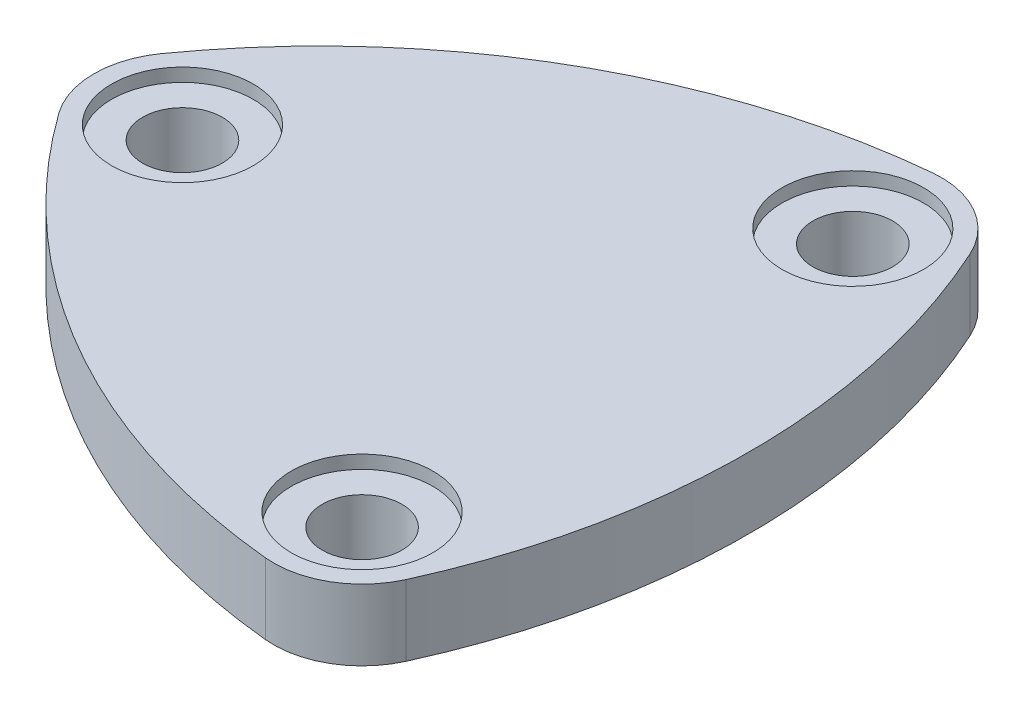
ISO-10303-21;
HEADER;
FILE_DESCRIPTION(('STEP AP214'),'2;1');
FILE_NAME('part.step','',(''),(''),'','','');
FILE_SCHEMA(('AUTOMOTIVE_DESIGN { 1 0 10303 214 1 1 1 1 }'));
ENDSEC;
DATA;
#1=APPLICATION_CONTEXT('core data for automotive mechanical design processes');
#2=APPLICATION_PROTOCOL_DEFINITION('international standard','automotive_design',2000,#1);
#3=PRODUCT_CONTEXT('',#1,'mechanical');
#4=PRODUCT('Part','Part','',(#3));
#5=PRODUCT_RELATED_PRODUCT_CATEGORY('part','',(#4));
#6=PRODUCT_DEFINITION_FORMATION('','',#4);
#7=PRODUCT_DEFINITION_CONTEXT('part definition',#1,'design');
#8=PRODUCT_DEFINITION('design','',#6,#7);
#9=PRODUCT_DEFINITION_SHAPE('','',#8);
#10=(LENGTH_UNIT() NAMED_UNIT(*) SI_UNIT(.MILLI.,.METRE.));
#11=(NAMED_UNIT(*) PLANE_ANGLE_UNIT() SI_UNIT($,.RADIAN.));
#12=(NAMED_UNIT(*) SI_UNIT($,.STERADIAN.) SOLID_ANGLE_UNIT());
#13=UNCERTAINTY_MEASURE_WITH_UNIT(LENGTH_MEASURE(1.E-05),#10,'distance_accuracy_value','');
#14=(GEOMETRIC_REPRESENTATION_CONTEXT(3) GLOBAL_UNCERTAINTY_ASSIGNED_CONTEXT((#13)) GLOBAL_UNIT_ASSIGNED_CONTEXT((#10,
#11,#12)) REPRESENTATION_CONTEXT('',''));
#15=CARTESIAN_POINT('',(0.,0.,0.));
#16=DIRECTION('',(0.,0.,1.));
#17=DIRECTION('',(1.,0.,0.));
#18=AXIS2_PLACEMENT_3D('',#15,#16,#17);
#19=CARTESIAN_POINT('',(16.0000000000001,8.,27.7128129211029));
#20=DIRECTION('',(0.,-1.,0.));
#21=DIRECTION('',(0.,0.,-1.));
#22=AXIS2_PLACEMENT_3D('',#19,#20,#21);
#23=CYLINDRICAL_SURFACE('',#22,4.5);
#24=CARTESIAN_POINT('',(16.0000000000001,0.,27.7128129211029));
#25=DIRECTION('',(0.,1.,0.));
#26=DIRECTION('',(0.,0.,1.));
#27=AXIS2_PLACEMENT_3D('',#24,#25,#26);
#28=CIRCLE('',#27,4.5);
#29=CARTESIAN_POINT('',(16.0000000000001,0.,32.2128129211029));
#30=VERTEX_POINT('',#29);
#31=EDGE_CURVE('E160',#30,#30,#28,.T.);
#32=ORIENTED_EDGE('',*,*,#31,.F.);
#33=EDGE_LOOP('',(#32));
#34=FACE_BOUND('',#33,.T.);
#35=CARTESIAN_POINT('',(16.0000000000001,6.5,27.7128129211029));
#36=DIRECTION('',(0.,1.,0.));
#37=DIRECTION('',(0.,0.,1.));
#38=AXIS2_PLACEMENT_3D('',#35,#36,#37);
#39=CIRCLE('',#38,4.5);
#40=CARTESIAN_POINT('',(16.0000000000001,6.5,32.2128129211029));
#41=VERTEX_POINT('',#40);
#42=EDGE_CURVE('E35',#41,#41,#39,.T.);
#43=ORIENTED_EDGE('',*,*,#42,.T.);
#44=EDGE_LOOP('',(#43));
#45=FACE_BOUND('',#44,.T.);
#46=ADVANCED_FACE('F31',(#34,#45),#23,.F.);
#47=CARTESIAN_POINT('',(16.0000000000001,8.,-27.712812921102));
#48=DIRECTION('',(0.,-1.,0.));
#49=DIRECTION('',(0.,0.,-1.));
#50=AXIS2_PLACEMENT_3D('',#47,#48,#49);
#51=CYLINDRICAL_SURFACE('',#50,4.5);
#52=CARTESIAN_POINT('',(16.0000000000001,0.,-27.712812921102));
#53=DIRECTION('',(0.,1.,0.));
#54=DIRECTION('',(0.,0.,1.));
#55=AXIS2_PLACEMENT_3D('',#52,#53,#54);
#56=CIRCLE('',#55,4.5);
#57=CARTESIAN_POINT('',(16.0000000000001,0.,-23.212812921102));
#58=VERTEX_POINT('',#57);
#59=EDGE_CURVE('E96',#58,#58,#56,.T.);
#60=ORIENTED_EDGE('',*,*,#59,.F.);
#61=EDGE_LOOP('',(#60));
#62=FACE_BOUND('',#61,.T.);
#63=CARTESIAN_POINT('',(16.0000000000001,6.5,-27.712812921102));
#64=DIRECTION('',(0.,1.,0.));
#65=DIRECTION('',(0.,0.,1.));
#66=AXIS2_PLACEMENT_3D('',#63,#64,#65);
#67=CIRCLE('',#66,4.5);
#68=CARTESIAN_POINT('',(16.0000000000001,6.5,-23.212812921102));
#69=VERTEX_POINT('',#68);
#70=EDGE_CURVE('E135',#69,#69,#67,.T.);
#71=ORIENTED_EDGE('',*,*,#70,.T.);
#72=EDGE_LOOP('',(#71));
#73=FACE_BOUND('',#72,.T.);
#74=ADVANCED_FACE('F190',(#62,#73),#51,.F.);
#75=CARTESIAN_POINT('',(-32.,8.,0.));
#76=DIRECTION('',(0.,-1.,0.));
#77=DIRECTION('',(0.,0.,-1.));
#78=AXIS2_PLACEMENT_3D('',#75,#76,#77);
#79=CYLINDRICAL_SURFACE('',#78,4.5);
#80=CARTESIAN_POINT('',(-32.,0.,0.));
#81=DIRECTION('',(0.,1.,0.));
#82=DIRECTION('',(0.,0.,1.));
#83=AXIS2_PLACEMENT_3D('',#80,#81,#82);
#84=CIRCLE('',#83,4.5);
#85=CARTESIAN_POINT('',(-32.,0.,4.5));
#86=VERTEX_POINT('',#85);
#87=EDGE_CURVE('E133',#86,#86,#84,.T.);
#88=ORIENTED_EDGE('',*,*,#87,.F.);
#89=EDGE_LOOP('',(#88));
#90=FACE_BOUND('',#89,.T.);
#91=CARTESIAN_POINT('',(-32.,6.5,0.));
#92=DIRECTION('',(0.,1.,0.));
#93=DIRECTION('',(0.,0.,1.));
#94=AXIS2_PLACEMENT_3D('',#91,#92,#93);
#95=CIRCLE('',#94,4.5);
#96=CARTESIAN_POINT('',(-32.,6.5,4.5));
#97=VERTEX_POINT('',#96);
#98=EDGE_CURVE('E131',#97,#97,#95,.T.);
#99=ORIENTED_EDGE('',*,*,#98,.T.);
#100=EDGE_LOOP('',(#99));
#101=FACE_BOUND('',#100,.T.);
#102=ADVANCED_FACE('F196',(#90,#101),#79,.F.);
#103=CARTESIAN_POINT('',(-45.0000000000009,8.,-3.05311331771918E-13));
#104=DIRECTION('',(0.,-1.,0.));
#105=DIRECTION('',(0.,0.,-1.));
#106=AXIS2_PLACEMENT_3D('',#103,#104,#105);
#107=CYLINDRICAL_SURFACE('',#106,77.0000000000008);
#108=CARTESIAN_POINT('',(-45.0000000000009,0.,-3.05311331771918E-13));
#109=DIRECTION('',(0.,1.,0.));
#110=DIRECTION('',(0.,0.,1.));
#111=AXIS2_PLACEMENT_3D('',#108,#109,#110);
#112=CIRCLE('',#111,77.0000000000008);
#113=CARTESIAN_POINT('',(25.1044776119406,0.,31.8490536555953));
#114=VERTEX_POINT('',#113);
#115=CARTESIAN_POINT('',(25.1044776119405,0.,-31.8490536555947));
#116=VERTEX_POINT('',#115);
#117=EDGE_CURVE('E119',#114,#116,#112,.T.);
#118=ORIENTED_EDGE('',*,*,#117,.T.);
#119=DIRECTION('',(0.,-1.,0.));
#120=VECTOR('',#119,1.);
#121=CARTESIAN_POINT('',(25.1044776119405,8.,-31.8490536555947));
#122=LINE('',#121,#120);
#123=CARTESIAN_POINT('',(25.1044776119405,8.,-31.8490536555947));
#124=VERTEX_POINT('',#123);
#125=EDGE_CURVE('E40',#124,#116,#122,.T.);
#126=ORIENTED_EDGE('',*,*,#125,.F.);
#127=CARTESIAN_POINT('',(-45.0000000000009,8.,-3.05311331771918E-13));
#128=DIRECTION('',(0.,1.,0.));
#129=DIRECTION('',(0.,0.,1.));
#130=AXIS2_PLACEMENT_3D('',#127,#128,#129);
#131=CIRCLE('',#130,77.0000000000008);
#132=CARTESIAN_POINT('',(25.1044776119406,8.,31.8490536555953));
#133=VERTEX_POINT('',#132);
#134=EDGE_CURVE('E111',#133,#124,#131,.T.);
#135=ORIENTED_EDGE('',*,*,#134,.F.);
#136=DIRECTION('',(0.,-1.,0.));
#137=VECTOR('',#136,1.);
#138=CARTESIAN_POINT('',(25.10447761194,8.,31.849053655595));
#139=LINE('',#138,#137);
#140=EDGE_CURVE('E11',#133,#114,#139,.T.);
#141=ORIENTED_EDGE('',*,*,#140,.T.);
#142=EDGE_LOOP('',(#118,#126,#135,#141));
#143=FACE_BOUND('',#142,.T.);
#144=ADVANCED_FACE('F33',(#143),#107,.T.);
#145=CARTESIAN_POINT('',(22.5000000000004,8.,38.9711431703006));
#146=DIRECTION('',(0.,-1.,0.));
#147=DIRECTION('',(0.,0.,-1.));
#148=AXIS2_PLACEMENT_3D('',#145,#146,#147);
#149=CYLINDRICAL_SURFACE('',#148,77.0000000000008);
#150=CARTESIAN_POINT('',(22.5000000000004,0.,38.9711431703006));
#151=DIRECTION('',(0.,1.,0.));
#152=DIRECTION('',(0.,0.,1.));
#153=AXIS2_PLACEMENT_3D('',#150,#151,#152);
#154=CIRCLE('',#153,77.0000000000008);
#155=CARTESIAN_POINT('',(-40.1343283582089,0.,-5.81658853288062));
#156=VERTEX_POINT('',#155);
#157=CARTESIAN_POINT('',(15.0298507462688,0.,-37.6656421884754));
#158=VERTEX_POINT('',#157);
#159=EDGE_CURVE('E103',#156,#158,#154,.F.);
#160=ORIENTED_EDGE('',*,*,#159,.F.);
#161=DIRECTION('',(0.,-1.,0.));
#162=VECTOR('',#161,1.);
#163=CARTESIAN_POINT('',(-40.1343283582089,8.,-5.81658853288062));
#164=LINE('',#163,#162);
#165=CARTESIAN_POINT('',(-40.1343283582089,8.,-5.81658853288062));
#166=VERTEX_POINT('',#165);
#167=EDGE_CURVE('E88',#166,#156,#164,.T.);
#168=ORIENTED_EDGE('',*,*,#167,.F.);
#169=CARTESIAN_POINT('',(22.5000000000004,8.,38.9711431703006));
#170=DIRECTION('',(0.,1.,0.));
#171=DIRECTION('',(0.,0.,1.));
#172=AXIS2_PLACEMENT_3D('',#169,#170,#171);
#173=CIRCLE('',#172,77.0000000000008);
#174=CARTESIAN_POINT('',(15.0298507462688,8.,-37.6656421884754));
#175=VERTEX_POINT('',#174);
#176=EDGE_CURVE('E102',#166,#175,#173,.F.);
#177=ORIENTED_EDGE('',*,*,#176,.T.);
#178=DIRECTION('',(0.,-1.,0.));
#179=VECTOR('',#178,1.);
#180=CARTESIAN_POINT('',(15.0298507462688,8.,-37.6656421884754));
#181=LINE('',#180,#179);
#182=EDGE_CURVE('E104',#175,#158,#181,.T.);
#183=ORIENTED_EDGE('',*,*,#182,.T.);
#184=EDGE_LOOP('',(#160,#168,#177,#183));
#185=FACE_BOUND('',#184,.T.);
#186=ADVANCED_FACE('F100',(#185),#149,.T.);
#187=CARTESIAN_POINT('',(22.5000000000004,8.,-38.9711431703006));
#188=DIRECTION('',(0.,-1.,0.));
#189=DIRECTION('',(0.,0.,-1.));
#190=AXIS2_PLACEMENT_3D('',#187,#188,#189);
#191=CYLINDRICAL_SURFACE('',#190,77.0000000000008);
#192=CARTESIAN_POINT('',(22.5000000000004,0.,-38.9711431703006));
#193=DIRECTION('',(0.,1.,0.));
#194=DIRECTION('',(0.,0.,1.));
#195=AXIS2_PLACEMENT_3D('',#192,#193,#194);
#196=CIRCLE('',#195,77.0000000000008);
#197=CARTESIAN_POINT('',(-40.1343283582089,0.,5.81658853288062));
#198=VERTEX_POINT('',#197);
#199=CARTESIAN_POINT('',(15.0298507462688,0.,37.6656421884754));
#200=VERTEX_POINT('',#199);
#201=EDGE_CURVE('E115',#198,#200,#196,.T.);
#202=ORIENTED_EDGE('',*,*,#201,.T.);
#203=DIRECTION('',(0.,-1.,0.));
#204=VECTOR('',#203,1.);
#205=CARTESIAN_POINT('',(15.0298507462688,8.,37.6656421884754));
#206=LINE('',#205,#204);
#207=CARTESIAN_POINT('',(15.0298507462687,8.,37.6656421884762));
#208=VERTEX_POINT('',#207);
#209=EDGE_CURVE('E113',#208,#200,#206,.T.);
#210=ORIENTED_EDGE('',*,*,#209,.F.);
#211=CARTESIAN_POINT('',(22.5000000000004,8.,-38.9711431703006));
#212=DIRECTION('',(0.,1.,0.));
#213=DIRECTION('',(0.,0.,1.));
#214=AXIS2_PLACEMENT_3D('',#211,#212,#213);
#215=CIRCLE('',#214,77.0000000000008);
#216=CARTESIAN_POINT('',(-40.1343283582089,8.,5.81658853288062));
#217=VERTEX_POINT('',#216);
#218=EDGE_CURVE('E110',#217,#208,#215,.T.);
#219=ORIENTED_EDGE('',*,*,#218,.F.);
#220=DIRECTION('',(0.,-1.,0.));
#221=VECTOR('',#220,1.);
#222=CARTESIAN_POINT('',(-40.1343283582089,8.,5.81658853288062));
#223=LINE('',#222,#221);
#224=EDGE_CURVE('E91',#217,#198,#223,.T.);
#225=ORIENTED_EDGE('',*,*,#224,.T.);
#226=EDGE_LOOP('',(#202,#210,#219,#225));
#227=FACE_BOUND('',#226,.T.);
#228=ADVANCED_FACE('F179',(#227),#191,.T.);
#229=CARTESIAN_POINT('',(-87.303069674035,8.,-0.0235853663133024));
#230=DIRECTION('',(0.,1.,0.));
#231=DIRECTION('',(0.,0.,1.));
#232=AXIS2_PLACEMENT_3D('',#229,#230,#231);
#233=PLANE('',#232);
#234=CARTESIAN_POINT('',(16.0000000000001,8.,27.7128129211029));
#235=DIRECTION('',(0.,1.,0.));
#236=DIRECTION('',(0.,0.,1.));
#237=AXIS2_PLACEMENT_3D('',#234,#235,#236);
#238=CIRCLE('',#237,8.);
#239=CARTESIAN_POINT('',(16.0000000000001,8.,35.7128129211029));
#240=VERTEX_POINT('',#239);
#241=EDGE_CURVE('E151',#240,#240,#238,.T.);
#242=ORIENTED_EDGE('',*,*,#241,.F.);
#243=EDGE_LOOP('',(#242));
#244=FACE_BOUND('',#243,.T.);
#245=CARTESIAN_POINT('',(16.0000000000001,8.,-27.712812921102));
#246=DIRECTION('',(0.,1.,0.));
#247=DIRECTION('',(0.,0.,1.));
#248=AXIS2_PLACEMENT_3D('',#245,#246,#247);
#249=CIRCLE('',#248,8.);
#250=CARTESIAN_POINT('',(16.0000000000001,8.,-19.712812921102));
#251=VERTEX_POINT('',#250);
#252=EDGE_CURVE('E144',#251,#251,#249,.T.);
#253=ORIENTED_EDGE('',*,*,#252,.F.);
#254=EDGE_LOOP('',(#253));
#255=FACE_BOUND('',#254,.T.);
#256=CARTESIAN_POINT('',(-32.,8.,0.));
#257=DIRECTION('',(0.,1.,0.));
#258=DIRECTION('',(0.,0.,1.));
#259=AXIS2_PLACEMENT_3D('',#256,#257,#258);
#260=CIRCLE('',#259,8.);
#261=CARTESIAN_POINT('',(-32.,8.,8.));
#262=VERTEX_POINT('',#261);
#263=EDGE_CURVE('E137',#262,#262,#260,.T.);
#264=ORIENTED_EDGE('',*,*,#263,.F.);
#265=EDGE_LOOP('',(#264));
#266=FACE_BOUND('',#265,.T.);
#267=ORIENTED_EDGE('',*,*,#218,.T.);
#268=CARTESIAN_POINT('',(16.0000000000001,8.,27.7128129211029));
#269=DIRECTION('',(0.,1.,0.));
#270=DIRECTION('',(0.,0.,1.));
#271=AXIS2_PLACEMENT_3D('',#268,#269,#270);
#272=CIRCLE('',#271,10.);
#273=EDGE_CURVE('E122',#208,#133,#272,.T.);
#274=ORIENTED_EDGE('',*,*,#273,.T.);
#275=ORIENTED_EDGE('',*,*,#134,.T.);
#276=CARTESIAN_POINT('',(16.0000000000001,8.,-27.712812921102));
#277=DIRECTION('',(0.,1.,0.));
#278=DIRECTION('',(0.,0.,1.));
#279=AXIS2_PLACEMENT_3D('',#276,#277,#278);
#280=CIRCLE('',#279,10.);
#281=EDGE_CURVE('E109',#124,#175,#280,.T.);
#282=ORIENTED_EDGE('',*,*,#281,.T.);
#283=ORIENTED_EDGE('',*,*,#176,.F.);
#284=CARTESIAN_POINT('',(-32.,8.,0.));
#285=DIRECTION('',(0.,1.,0.));
#286=DIRECTION('',(0.,0.,1.));
#287=AXIS2_PLACEMENT_3D('',#284,#285,#286);
#288=CIRCLE('',#287,10.);
#289=EDGE_CURVE('E85',#166,#217,#288,.T.);
#290=ORIENTED_EDGE('',*,*,#289,.T.);
#291=EDGE_LOOP('',(#267,#274,#275,#282,#283,#290));
#292=FACE_BOUND('',#291,.T.);
#293=ADVANCED_FACE('F107',(#244,#255,#266,#292),#233,.T.);
#294=CARTESIAN_POINT('',(-87.303069674035,0.,-0.0235853663133024));
#295=DIRECTION('',(0.,1.,0.));
#296=DIRECTION('',(0.,0.,1.));
#297=AXIS2_PLACEMENT_3D('',#294,#295,#296);
#298=PLANE('',#297);
#299=ORIENTED_EDGE('',*,*,#117,.F.);
#300=CARTESIAN_POINT('',(16.0000000000001,0.,27.7128129211029));
#301=DIRECTION('',(0.,1.,0.));
#302=DIRECTION('',(0.,0.,1.));
#303=AXIS2_PLACEMENT_3D('',#300,#301,#302);
#304=CIRCLE('',#303,10.);
#305=EDGE_CURVE('E48',#200,#114,#304,.T.);
#306=ORIENTED_EDGE('',*,*,#305,.F.);
#307=ORIENTED_EDGE('',*,*,#201,.F.);
#308=CARTESIAN_POINT('',(-32.,0.,0.));
#309=DIRECTION('',(0.,1.,0.));
#310=DIRECTION('',(0.,0.,1.));
#311=AXIS2_PLACEMENT_3D('',#308,#309,#310);
#312=CIRCLE('',#311,10.);
#313=EDGE_CURVE('E54',#156,#198,#312,.T.);
#314=ORIENTED_EDGE('',*,*,#313,.F.);
#315=ORIENTED_EDGE('',*,*,#159,.T.);
#316=CARTESIAN_POINT('',(16.0000000000001,0.,-27.712812921102));
#317=DIRECTION('',(0.,1.,0.));
#318=DIRECTION('',(0.,0.,1.));
#319=AXIS2_PLACEMENT_3D('',#316,#317,#318);
#320=CIRCLE('',#319,10.);
#321=EDGE_CURVE('E161',#116,#158,#320,.T.);
#322=ORIENTED_EDGE('',*,*,#321,.F.);
#323=EDGE_LOOP('',(#299,#306,#307,#314,#315,#322));
#324=FACE_BOUND('',#323,.T.);
#325=ORIENTED_EDGE('',*,*,#31,.T.);
#326=EDGE_LOOP('',(#325));
#327=FACE_BOUND('',#326,.T.);
#328=ORIENTED_EDGE('',*,*,#59,.T.);
#329=EDGE_LOOP('',(#328));
#330=FACE_BOUND('',#329,.T.);
#331=ORIENTED_EDGE('',*,*,#87,.T.);
#332=EDGE_LOOP('',(#331));
#333=FACE_BOUND('',#332,.T.);
#334=ADVANCED_FACE('F174',(#324,#327,#330,#333),#298,.F.);
#335=CARTESIAN_POINT('',(16.0000000000001,8.,27.7128129211029));
#336=DIRECTION('',(0.,-1.,0.));
#337=DIRECTION('',(0.,0.,-1.));
#338=AXIS2_PLACEMENT_3D('',#335,#336,#337);
#339=CYLINDRICAL_SURFACE('',#338,10.);
#340=ORIENTED_EDGE('',*,*,#140,.F.);
#341=ORIENTED_EDGE('',*,*,#273,.F.);
#342=ORIENTED_EDGE('',*,*,#209,.T.);
#343=ORIENTED_EDGE('',*,*,#305,.T.);
#344=EDGE_LOOP('',(#340,#341,#342,#343));
#345=FACE_BOUND('',#344,.T.);
#346=ADVANCED_FACE('F169',(#345),#339,.T.);
#347=CARTESIAN_POINT('',(16.0000000000001,8.,-27.712812921102));
#348=DIRECTION('',(0.,-1.,0.));
#349=DIRECTION('',(0.,0.,-1.));
#350=AXIS2_PLACEMENT_3D('',#347,#348,#349);
#351=CYLINDRICAL_SURFACE('',#350,10.);
#352=ORIENTED_EDGE('',*,*,#281,.F.);
#353=ORIENTED_EDGE('',*,*,#125,.T.);
#354=ORIENTED_EDGE('',*,*,#321,.T.);
#355=ORIENTED_EDGE('',*,*,#182,.F.);
#356=EDGE_LOOP('',(#352,#353,#354,#355));
#357=FACE_BOUND('',#356,.T.);
#358=ADVANCED_FACE('F177',(#357),#351,.T.);
#359=CARTESIAN_POINT('',(-32.,8.,0.));
#360=DIRECTION('',(0.,-1.,0.));
#361=DIRECTION('',(0.,0.,-1.));
#362=AXIS2_PLACEMENT_3D('',#359,#360,#361);
#363=CYLINDRICAL_SURFACE('',#362,10.);
#364=ORIENTED_EDGE('',*,*,#289,.F.);
#365=ORIENTED_EDGE('',*,*,#167,.T.);
#366=ORIENTED_EDGE('',*,*,#313,.T.);
#367=ORIENTED_EDGE('',*,*,#224,.F.);
#368=EDGE_LOOP('',(#364,#365,#366,#367));
#369=FACE_BOUND('',#368,.T.);
#370=ADVANCED_FACE('F87',(#369),#363,.T.);
#371=CARTESIAN_POINT('',(-32.,6.5,0.));
#372=DIRECTION('',(0.,1.,0.));
#373=DIRECTION('',(0.,0.,1.));
#374=AXIS2_PLACEMENT_3D('',#371,#372,#373);
#375=CYLINDRICAL_SURFACE('',#374,8.);
#376=CARTESIAN_POINT('',(-32.,6.5,0.));
#377=DIRECTION('',(0.,1.,0.));
#378=DIRECTION('',(0.,0.,1.));
#379=AXIS2_PLACEMENT_3D('',#376,#377,#378);
#380=CIRCLE('',#379,8.);
#381=CARTESIAN_POINT('',(-32.,6.5,8.));
#382=VERTEX_POINT('',#381);
#383=EDGE_CURVE('E134',#382,#382,#380,.T.);
#384=ORIENTED_EDGE('',*,*,#383,.F.);
#385=EDGE_LOOP('',(#384));
#386=FACE_BOUND('',#385,.T.);
#387=ORIENTED_EDGE('',*,*,#263,.T.);
#388=EDGE_LOOP('',(#387));
#389=FACE_BOUND('',#388,.T.);
#390=ADVANCED_FACE('F213',(#386,#389),#375,.F.);
#391=CARTESIAN_POINT('',(-32.,6.5,0.));
#392=DIRECTION('',(0.,1.,0.));
#393=DIRECTION('',(0.,0.,1.));
#394=AXIS2_PLACEMENT_3D('',#391,#392,#393);
#395=PLANE('',#394);
#396=ORIENTED_EDGE('',*,*,#98,.F.);
#397=EDGE_LOOP('',(#396));
#398=FACE_BOUND('',#397,.T.);
#399=ORIENTED_EDGE('',*,*,#383,.T.);
#400=EDGE_LOOP('',(#399));
#401=FACE_BOUND('',#400,.T.);
#402=ADVANCED_FACE('F221',(#398,#401),#395,.T.);
#403=CARTESIAN_POINT('',(16.0000000000001,6.5,-27.712812921102));
#404=DIRECTION('',(0.,1.,0.));
#405=DIRECTION('',(0.,0.,1.));
#406=AXIS2_PLACEMENT_3D('',#403,#404,#405);
#407=CYLINDRICAL_SURFACE('',#406,8.);
#408=CARTESIAN_POINT('',(16.0000000000001,6.5,-27.712812921102));
#409=DIRECTION('',(0.,1.,0.));
#410=DIRECTION('',(0.,0.,1.));
#411=AXIS2_PLACEMENT_3D('',#408,#409,#410);
#412=CIRCLE('',#411,8.);
#413=CARTESIAN_POINT('',(16.0000000000001,6.5,-19.712812921102));
#414=VERTEX_POINT('',#413);
#415=EDGE_CURVE('E138',#414,#414,#412,.T.);
#416=ORIENTED_EDGE('',*,*,#415,.F.);
#417=EDGE_LOOP('',(#416));
#418=FACE_BOUND('',#417,.T.);
#419=ORIENTED_EDGE('',*,*,#252,.T.);
#420=EDGE_LOOP('',(#419));
#421=FACE_BOUND('',#420,.T.);
#422=ADVANCED_FACE('F225',(#418,#421),#407,.F.);
#423=CARTESIAN_POINT('',(16.0000000000001,6.5,-27.712812921102));
#424=DIRECTION('',(0.,1.,0.));
#425=DIRECTION('',(0.,0.,1.));
#426=AXIS2_PLACEMENT_3D('',#423,#424,#425);
#427=PLANE('',#426);
#428=ORIENTED_EDGE('',*,*,#70,.F.);
#429=EDGE_LOOP('',(#428));
#430=FACE_BOUND('',#429,.T.);
#431=ORIENTED_EDGE('',*,*,#415,.T.);
#432=EDGE_LOOP('',(#431));
#433=FACE_BOUND('',#432,.T.);
#434=ADVANCED_FACE('F229',(#430,#433),#427,.T.);
#435=CARTESIAN_POINT('',(16.0000000000001,6.5,27.7128129211029));
#436=DIRECTION('',(0.,1.,0.));
#437=DIRECTION('',(0.,0.,1.));
#438=AXIS2_PLACEMENT_3D('',#435,#436,#437);
#439=CYLINDRICAL_SURFACE('',#438,8.);
#440=CARTESIAN_POINT('',(16.0000000000001,6.5,27.7128129211029));
#441=DIRECTION('',(0.,1.,0.));
#442=DIRECTION('',(0.,0.,1.));
#443=AXIS2_PLACEMENT_3D('',#440,#441,#442);
#444=CIRCLE('',#443,8.);
#445=CARTESIAN_POINT('',(16.0000000000001,6.5,35.7128129211029));
#446=VERTEX_POINT('',#445);
#447=EDGE_CURVE('E248',#446,#446,#444,.T.);
#448=ORIENTED_EDGE('',*,*,#447,.F.);
#449=EDGE_LOOP('',(#448));
#450=FACE_BOUND('',#449,.T.);
#451=ORIENTED_EDGE('',*,*,#241,.T.);
#452=EDGE_LOOP('',(#451));
#453=FACE_BOUND('',#452,.T.);
#454=ADVANCED_FACE('F233',(#450,#453),#439,.F.);
#455=CARTESIAN_POINT('',(16.0000000000001,6.5,27.7128129211029));
#456=DIRECTION('',(0.,1.,0.));
#457=DIRECTION('',(0.,0.,1.));
#458=AXIS2_PLACEMENT_3D('',#455,#456,#457);
#459=PLANE('',#458);
#460=ORIENTED_EDGE('',*,*,#42,.F.);
#461=EDGE_LOOP('',(#460));
#462=FACE_BOUND('',#461,.T.);
#463=ORIENTED_EDGE('',*,*,#447,.T.);
#464=EDGE_LOOP('',(#463));
#465=FACE_BOUND('',#464,.T.);
#466=ADVANCED_FACE('F237',(#462,#465),#459,.T.);
#467=CLOSED_SHELL('',(#46,#74,#102,#144,#186,#228,#293,#334,#346,#358,#370,#390,#402,#422,#434,
#454,#466));
#468=MANIFOLD_SOLID_BREP('B2',#467);
#469=ADVANCED_BREP_SHAPE_REPRESENTATION('',(#18,#468),#14);
#470=SHAPE_DEFINITION_REPRESENTATION(#9,#469);
ENDSEC;
END-ISO-10303-21;
